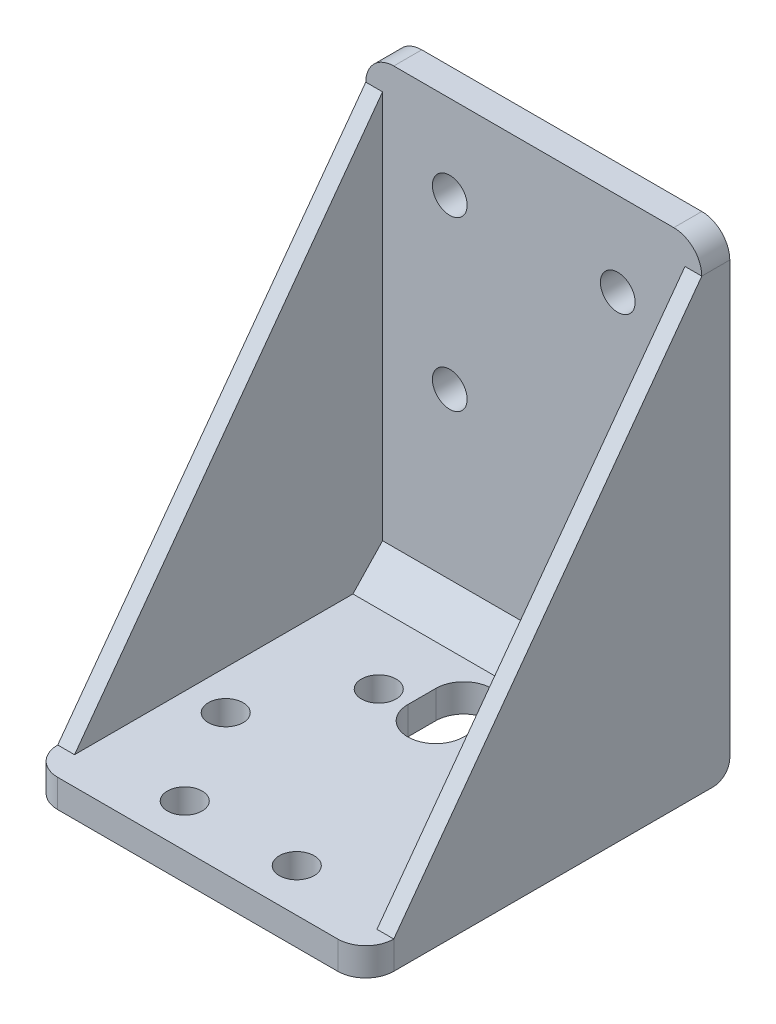
ISO-10303-21;
HEADER;
FILE_DESCRIPTION(('STEP AP214'),'2;1');
FILE_NAME('part.step','',(''),(''),'','','');
FILE_SCHEMA(('AUTOMOTIVE_DESIGN { 1 0 10303 214 1 1 1 1 }'));
ENDSEC;
DATA;
#1=APPLICATION_CONTEXT('core data for automotive mechanical design processes');
#2=APPLICATION_PROTOCOL_DEFINITION('international standard','automotive_design',2000,#1);
#3=PRODUCT_CONTEXT('',#1,'mechanical');
#4=PRODUCT('Part','Part','',(#3));
#5=PRODUCT_RELATED_PRODUCT_CATEGORY('part','',(#4));
#6=PRODUCT_DEFINITION_FORMATION('','',#4);
#7=PRODUCT_DEFINITION_CONTEXT('part definition',#1,'design');
#8=PRODUCT_DEFINITION('design','',#6,#7);
#9=PRODUCT_DEFINITION_SHAPE('','',#8);
#10=(LENGTH_UNIT() NAMED_UNIT(*) SI_UNIT(.MILLI.,.METRE.));
#11=(NAMED_UNIT(*) PLANE_ANGLE_UNIT() SI_UNIT($,.RADIAN.));
#12=(NAMED_UNIT(*) SI_UNIT($,.STERADIAN.) SOLID_ANGLE_UNIT());
#13=UNCERTAINTY_MEASURE_WITH_UNIT(LENGTH_MEASURE(1.E-05),#10,'distance_accuracy_value','');
#14=(GEOMETRIC_REPRESENTATION_CONTEXT(3) GLOBAL_UNCERTAINTY_ASSIGNED_CONTEXT((#13)) GLOBAL_UNIT_ASSIGNED_CONTEXT((#10,
#11,#12)) REPRESENTATION_CONTEXT('',''));
#15=CARTESIAN_POINT('',(0.,0.,0.));
#16=DIRECTION('',(0.,0.,1.));
#17=DIRECTION('',(1.,0.,0.));
#18=AXIS2_PLACEMENT_3D('',#15,#16,#17);
#19=CARTESIAN_POINT('',(57.,80.,0.));
#20=DIRECTION('',(0.,0.591363663627517,0.806404995855706));
#21=DIRECTION('',(0.,-0.806404995855706,0.591363663627517));
#22=AXIS2_PLACEMENT_3D('',#19,#20,#21);
#23=PLANE('',#22);
#24=DIRECTION('',(1.,0.,0.));
#25=VECTOR('',#24,1.);
#26=CARTESIAN_POINT('',(57.,80.,0.));
#27=LINE('',#26,#25);
#28=CARTESIAN_POINT('',(60.,80.,0.));
#29=VERTEX_POINT('',#28);
#30=CARTESIAN_POINT('',(57.,80.,0.));
#31=VERTEX_POINT('',#30);
#32=EDGE_CURVE('E250',#29,#31,#27,.F.);
#33=ORIENTED_EDGE('',*,*,#32,.T.);
#34=DIRECTION('',(0.,0.806404995855705,-0.591363663627517));
#35=VECTOR('',#34,1.);
#36=CARTESIAN_POINT('',(57.,5.,55.));
#37=LINE('',#36,#35);
#38=CARTESIAN_POINT('',(57.,5.,55.));
#39=VERTEX_POINT('',#38);
#40=EDGE_CURVE('E239',#39,#31,#37,.T.);
#41=ORIENTED_EDGE('',*,*,#40,.F.);
#42=DIRECTION('',(1.,0.,0.));
#43=VECTOR('',#42,1.);
#44=CARTESIAN_POINT('',(57.,5.,55.));
#45=LINE('',#44,#43);
#46=CARTESIAN_POINT('',(60.,5.,55.));
#47=VERTEX_POINT('',#46);
#48=EDGE_CURVE('E261',#39,#47,#45,.T.);
#49=ORIENTED_EDGE('',*,*,#48,.T.);
#50=DIRECTION('',(0.,0.806404995855706,-0.591363663627517));
#51=VECTOR('',#50,1.);
#52=CARTESIAN_POINT('',(60.,5.,55.));
#53=LINE('',#52,#51);
#54=EDGE_CURVE('E256',#47,#29,#53,.T.);
#55=ORIENTED_EDGE('',*,*,#54,.T.);
#56=EDGE_LOOP('',(#33,#41,#49,#55));
#57=FACE_BOUND('',#56,.T.);
#58=ADVANCED_FACE('F52',(#57),#23,.T.);
#59=CARTESIAN_POINT('',(60.,5.,0.));
#60=DIRECTION('',(-1.,0.,0.));
#61=DIRECTION('',(0.,0.,1.));
#62=AXIS2_PLACEMENT_3D('',#59,#60,#61);
#63=PLANE('',#62);
#64=DIRECTION('',(0.,-1.,0.));
#65=VECTOR('',#64,1.);
#66=CARTESIAN_POINT('',(60.,0.,-5.));
#67=LINE('',#66,#65);
#68=CARTESIAN_POINT('',(60.,80.,-5.));
#69=VERTEX_POINT('',#68);
#70=CARTESIAN_POINT('',(60.,3.,-5.));
#71=VERTEX_POINT('',#70);
#72=EDGE_CURVE('E225',#69,#71,#67,.T.);
#73=ORIENTED_EDGE('',*,*,#72,.F.);
#74=DIRECTION('',(0.,0.,1.));
#75=VECTOR('',#74,1.);
#76=CARTESIAN_POINT('',(60.,80.,0.));
#77=LINE('',#76,#75);
#78=EDGE_CURVE('E309',#69,#29,#77,.T.);
#79=ORIENTED_EDGE('',*,*,#78,.T.);
#80=ORIENTED_EDGE('',*,*,#54,.F.);
#81=DIRECTION('',(0.,1.,0.));
#82=VECTOR('',#81,1.);
#83=CARTESIAN_POINT('',(60.,5.,55.));
#84=LINE('',#83,#82);
#85=CARTESIAN_POINT('',(60.,0.,55.));
#86=VERTEX_POINT('',#85);
#87=EDGE_CURVE('E307',#47,#86,#84,.F.);
#88=ORIENTED_EDGE('',*,*,#87,.T.);
#89=DIRECTION('',(0.,0.,1.));
#90=VECTOR('',#89,1.);
#91=CARTESIAN_POINT('',(60.,0.,60.));
#92=LINE('',#91,#90);
#93=CARTESIAN_POINT('',(60.,0.,-2.));
#94=VERTEX_POINT('',#93);
#95=EDGE_CURVE('E230',#94,#86,#92,.T.);
#96=ORIENTED_EDGE('',*,*,#95,.F.);
#97=CARTESIAN_POINT('',(60.,3.,-2.));
#98=DIRECTION('',(-1.,0.,0.));
#99=DIRECTION('',(0.,0.,1.));
#100=AXIS2_PLACEMENT_3D('',#97,#98,#99);
#101=CIRCLE('',#100,3.);
#102=EDGE_CURVE('E304',#94,#71,#101,.F.);
#103=ORIENTED_EDGE('',*,*,#102,.T.);
#104=EDGE_LOOP('',(#73,#79,#80,#88,#96,#103));
#105=FACE_BOUND('',#104,.T.);
#106=ADVANCED_FACE('F376',(#105),#63,.F.);
#107=CARTESIAN_POINT('',(0.,5.,0.));
#108=DIRECTION('',(1.,0.,0.));
#109=DIRECTION('',(0.,0.,-1.));
#110=AXIS2_PLACEMENT_3D('',#107,#108,#109);
#111=PLANE('',#110);
#112=DIRECTION('',(0.,-0.806404995855706,0.591363663627517));
#113=VECTOR('',#112,1.);
#114=CARTESIAN_POINT('',(0.,80.,0.));
#115=LINE('',#114,#113);
#116=CARTESIAN_POINT('',(0.,80.,0.));
#117=VERTEX_POINT('',#116);
#118=CARTESIAN_POINT('',(0.,5.,55.));
#119=VERTEX_POINT('',#118);
#120=EDGE_CURVE('E244',#117,#119,#115,.T.);
#121=ORIENTED_EDGE('',*,*,#120,.F.);
#122=DIRECTION('',(0.,0.,1.));
#123=VECTOR('',#122,1.);
#124=CARTESIAN_POINT('',(0.,80.,0.));
#125=LINE('',#124,#123);
#126=CARTESIAN_POINT('',(0.,80.,-5.));
#127=VERTEX_POINT('',#126);
#128=EDGE_CURVE('E328',#117,#127,#125,.F.);
#129=ORIENTED_EDGE('',*,*,#128,.T.);
#130=DIRECTION('',(0.,1.,0.));
#131=VECTOR('',#130,1.);
#132=CARTESIAN_POINT('',(0.,85.,-5.));
#133=LINE('',#132,#131);
#134=CARTESIAN_POINT('',(0.,3.,-5.));
#135=VERTEX_POINT('',#134);
#136=EDGE_CURVE('E219',#135,#127,#133,.T.);
#137=ORIENTED_EDGE('',*,*,#136,.F.);
#138=CARTESIAN_POINT('',(0.,3.,-2.));
#139=DIRECTION('',(1.,0.,0.));
#140=DIRECTION('',(0.,0.,-1.));
#141=AXIS2_PLACEMENT_3D('',#138,#139,#140);
#142=CIRCLE('',#141,3.);
#143=CARTESIAN_POINT('',(0.,0.,-2.));
#144=VERTEX_POINT('',#143);
#145=EDGE_CURVE('E299',#135,#144,#142,.F.);
#146=ORIENTED_EDGE('',*,*,#145,.T.);
#147=DIRECTION('',(0.,0.,-1.));
#148=VECTOR('',#147,1.);
#149=CARTESIAN_POINT('',(0.,0.,0.));
#150=LINE('',#149,#148);
#151=CARTESIAN_POINT('',(0.,0.,55.));
#152=VERTEX_POINT('',#151);
#153=EDGE_CURVE('E235',#152,#144,#150,.T.);
#154=ORIENTED_EDGE('',*,*,#153,.F.);
#155=DIRECTION('',(0.,1.,0.));
#156=VECTOR('',#155,1.);
#157=CARTESIAN_POINT('',(0.,5.,55.));
#158=LINE('',#157,#156);
#159=EDGE_CURVE('E325',#152,#119,#158,.T.);
#160=ORIENTED_EDGE('',*,*,#159,.T.);
#161=EDGE_LOOP('',(#121,#129,#137,#146,#154,#160));
#162=FACE_BOUND('',#161,.T.);
#163=ADVANCED_FACE('F352',(#162),#111,.F.);
#164=DIRECTION('',(0.,0.806404995855705,-0.591363663627517));
#165=VECTOR('',#164,1.);
#166=CARTESIAN_POINT('',(3.,5.,55.));
#167=LINE('',#166,#165);
#168=CARTESIAN_POINT('',(3.,5.,55.));
#169=VERTEX_POINT('',#168);
#170=CARTESIAN_POINT('',(3.,80.,0.));
#171=VERTEX_POINT('',#170);
#172=EDGE_CURVE('E272',#169,#171,#167,.T.);
#173=ORIENTED_EDGE('',*,*,#172,.T.);
#174=DIRECTION('',(-1.,0.,0.));
#175=VECTOR('',#174,1.);
#176=CARTESIAN_POINT('',(0.,80.,0.));
#177=LINE('',#176,#175);
#178=EDGE_CURVE('E240',#171,#117,#177,.T.);
#179=ORIENTED_EDGE('',*,*,#178,.T.);
#180=ORIENTED_EDGE('',*,*,#120,.T.);
#181=DIRECTION('',(1.,0.,0.));
#182=VECTOR('',#181,1.);
#183=CARTESIAN_POINT('',(3.,5.,55.));
#184=LINE('',#183,#182);
#185=EDGE_CURVE('E237',#169,#119,#184,.F.);
#186=ORIENTED_EDGE('',*,*,#185,.F.);
#187=EDGE_LOOP('',(#173,#179,#180,#186));
#188=FACE_BOUND('',#187,.T.);
#189=ADVANCED_FACE('F354',(#188),#23,.T.);
#190=CARTESIAN_POINT('',(0.,5.,0.));
#191=DIRECTION('',(0.,1.,0.));
#192=DIRECTION('',(0.,0.,1.));
#193=AXIS2_PLACEMENT_3D('',#190,#191,#192);
#194=PLANE('',#193);
#195=CARTESIAN_POINT('',(40.,5.,17.6794919243114));
#196=DIRECTION('',(0.,1.,0.));
#197=DIRECTION('',(0.,0.,1.));
#198=AXIS2_PLACEMENT_3D('',#195,#196,#197);
#199=CIRCLE('',#198,3.09999999999998);
#200=CARTESIAN_POINT('',(40.,5.,20.7794919243113));
#201=VERTEX_POINT('',#200);
#202=EDGE_CURVE('E820',#201,#201,#199,.T.);
#203=ORIENTED_EDGE('',*,*,#202,.F.);
#204=EDGE_LOOP('',(#203));
#205=FACE_BOUND('',#204,.T.);
#206=CARTESIAN_POINT('',(20.,5.,17.6794919243111));
#207=DIRECTION('',(0.,1.,0.));
#208=DIRECTION('',(0.,0.,1.));
#209=AXIS2_PLACEMENT_3D('',#206,#207,#208);
#210=CIRCLE('',#209,3.09999999999999);
#211=CARTESIAN_POINT('',(20.,5.,20.7794919243111));
#212=VERTEX_POINT('',#211);
#213=EDGE_CURVE('E816',#212,#212,#210,.T.);
#214=ORIENTED_EDGE('',*,*,#213,.F.);
#215=EDGE_LOOP('',(#214));
#216=FACE_BOUND('',#215,.T.);
#217=CARTESIAN_POINT('',(50.,5.,35.));
#218=DIRECTION('',(0.,1.,0.));
#219=DIRECTION('',(0.,0.,1.));
#220=AXIS2_PLACEMENT_3D('',#217,#218,#219);
#221=CIRCLE('',#220,3.09999999999999);
#222=CARTESIAN_POINT('',(50.,5.,38.1));
#223=VERTEX_POINT('',#222);
#224=EDGE_CURVE('E812',#223,#223,#221,.T.);
#225=ORIENTED_EDGE('',*,*,#224,.F.);
#226=EDGE_LOOP('',(#225));
#227=FACE_BOUND('',#226,.T.);
#228=CARTESIAN_POINT('',(40.,5.,52.3205080756888));
#229=DIRECTION('',(0.,1.,0.));
#230=DIRECTION('',(0.,0.,1.));
#231=AXIS2_PLACEMENT_3D('',#228,#229,#230);
#232=CIRCLE('',#231,3.09999999999998);
#233=CARTESIAN_POINT('',(40.,5.,55.4205080756888));
#234=VERTEX_POINT('',#233);
#235=EDGE_CURVE('E808',#234,#234,#232,.T.);
#236=ORIENTED_EDGE('',*,*,#235,.F.);
#237=EDGE_LOOP('',(#236));
#238=FACE_BOUND('',#237,.T.);
#239=CARTESIAN_POINT('',(20.,5.,52.3205080756887));
#240=DIRECTION('',(0.,1.,0.));
#241=DIRECTION('',(0.,0.,1.));
#242=AXIS2_PLACEMENT_3D('',#239,#240,#241);
#243=CIRCLE('',#242,3.09999999999999);
#244=CARTESIAN_POINT('',(20.,5.,55.4205080756887));
#245=VERTEX_POINT('',#244);
#246=EDGE_CURVE('E804',#245,#245,#243,.T.);
#247=ORIENTED_EDGE('',*,*,#246,.F.);
#248=EDGE_LOOP('',(#247));
#249=FACE_BOUND('',#248,.T.);
#250=CARTESIAN_POINT('',(10.,5.,35.));
#251=DIRECTION('',(0.,1.,0.));
#252=DIRECTION('',(0.,0.,1.));
#253=AXIS2_PLACEMENT_3D('',#250,#251,#252);
#254=CIRCLE('',#253,3.09999999999999);
#255=CARTESIAN_POINT('',(10.,5.,38.1));
#256=VERTEX_POINT('',#255);
#257=EDGE_CURVE('E733',#256,#256,#254,.T.);
#258=ORIENTED_EDGE('',*,*,#257,.F.);
#259=EDGE_LOOP('',(#258));
#260=FACE_BOUND('',#259,.T.);
#261=CARTESIAN_POINT('',(30.,5.,12.5));
#262=DIRECTION('',(0.,1.,0.));
#263=DIRECTION('',(0.,0.,1.));
#264=AXIS2_PLACEMENT_3D('',#261,#262,#263);
#265=CIRCLE('',#264,5.);
#266=CARTESIAN_POINT('',(35.,5.,12.5));
#267=VERTEX_POINT('',#266);
#268=CARTESIAN_POINT('',(25.,5.,12.5));
#269=VERTEX_POINT('',#268);
#270=EDGE_CURVE('E216',#267,#269,#265,.T.);
#271=ORIENTED_EDGE('',*,*,#270,.F.);
#272=DIRECTION('',(0.,0.,-1.));
#273=VECTOR('',#272,1.);
#274=CARTESIAN_POINT('',(35.,5.,0.));
#275=LINE('',#274,#273);
#276=CARTESIAN_POINT('',(35.,5.,17.5));
#277=VERTEX_POINT('',#276);
#278=EDGE_CURVE('E209',#277,#267,#275,.T.);
#279=ORIENTED_EDGE('',*,*,#278,.F.);
#280=CARTESIAN_POINT('',(30.,5.,17.5));
#281=DIRECTION('',(0.,1.,0.));
#282=DIRECTION('',(0.,0.,1.));
#283=AXIS2_PLACEMENT_3D('',#280,#281,#282);
#284=CIRCLE('',#283,5.);
#285=CARTESIAN_POINT('',(25.,5.,17.5));
#286=VERTEX_POINT('',#285);
#287=EDGE_CURVE('E185',#286,#277,#284,.T.);
#288=ORIENTED_EDGE('',*,*,#287,.F.);
#289=DIRECTION('',(0.,0.,1.));
#290=VECTOR('',#289,1.);
#291=CARTESIAN_POINT('',(25.,5.,0.));
#292=LINE('',#291,#290);
#293=EDGE_CURVE('E214',#269,#286,#292,.T.);
#294=ORIENTED_EDGE('',*,*,#293,.F.);
#295=EDGE_LOOP('',(#271,#279,#288,#294));
#296=FACE_BOUND('',#295,.T.);
#297=ORIENTED_EDGE('',*,*,#185,.T.);
#298=CARTESIAN_POINT('',(5.,5.,55.));
#299=DIRECTION('',(0.,1.,0.));
#300=DIRECTION('',(0.,0.,1.));
#301=AXIS2_PLACEMENT_3D('',#298,#299,#300);
#302=CIRCLE('',#301,5.);
#303=CARTESIAN_POINT('',(5.,5.,60.));
#304=VERTEX_POINT('',#303);
#305=EDGE_CURVE('E332',#119,#304,#302,.T.);
#306=ORIENTED_EDGE('',*,*,#305,.T.);
#307=DIRECTION('',(-1.,0.,0.));
#308=VECTOR('',#307,1.);
#309=CARTESIAN_POINT('',(0.,5.,60.));
#310=LINE('',#309,#308);
#311=CARTESIAN_POINT('',(55.,5.,60.));
#312=VERTEX_POINT('',#311);
#313=EDGE_CURVE('E233',#312,#304,#310,.T.);
#314=ORIENTED_EDGE('',*,*,#313,.F.);
#315=CARTESIAN_POINT('',(55.,5.,55.));
#316=DIRECTION('',(0.,1.,0.));
#317=DIRECTION('',(0.,0.,1.));
#318=AXIS2_PLACEMENT_3D('',#315,#316,#317);
#319=CIRCLE('',#318,5.);
#320=EDGE_CURVE('E330',#312,#47,#319,.T.);
#321=ORIENTED_EDGE('',*,*,#320,.T.);
#322=ORIENTED_EDGE('',*,*,#48,.F.);
#323=DIRECTION('',(0.,0.,1.));
#324=VECTOR('',#323,1.);
#325=CARTESIAN_POINT('',(57.,5.,0.));
#326=LINE('',#325,#324);
#327=CARTESIAN_POINT('',(57.,5.,5.29154741695946));
#328=VERTEX_POINT('',#327);
#329=EDGE_CURVE('E286',#328,#39,#326,.T.);
#330=ORIENTED_EDGE('',*,*,#329,.F.);
#331=DIRECTION('',(-1.,0.,0.));
#332=VECTOR('',#331,1.);
#333=CARTESIAN_POINT('',(3.,5.,5.29154741695946));
#334=LINE('',#333,#332);
#335=CARTESIAN_POINT('',(3.,5.,5.29154741695946));
#336=VERTEX_POINT('',#335);
#337=EDGE_CURVE('E260',#328,#336,#334,.T.);
#338=ORIENTED_EDGE('',*,*,#337,.T.);
#339=DIRECTION('',(0.,0.,1.));
#340=VECTOR('',#339,1.);
#341=CARTESIAN_POINT('',(3.,5.,0.));
#342=LINE('',#341,#340);
#343=EDGE_CURVE('E276',#336,#169,#342,.T.);
#344=ORIENTED_EDGE('',*,*,#343,.T.);
#345=EDGE_LOOP('',(#297,#306,#314,#321,#322,#330,#338,#344));
#346=FACE_BOUND('',#345,.T.);
#347=ADVANCED_FACE('F342',(#205,#216,#227,#238,#249,#260,#296,#346),#194,.T.);
#348=CARTESIAN_POINT('',(0.,0.,60.));
#349=DIRECTION('',(0.,0.,-1.));
#350=DIRECTION('',(-1.,0.,0.));
#351=AXIS2_PLACEMENT_3D('',#348,#349,#350);
#352=PLANE('',#351);
#353=ORIENTED_EDGE('',*,*,#313,.T.);
#354=DIRECTION('',(0.,1.,0.));
#355=VECTOR('',#354,1.);
#356=CARTESIAN_POINT('',(5.,0.,60.));
#357=LINE('',#356,#355);
#358=CARTESIAN_POINT('',(5.,0.,60.));
#359=VERTEX_POINT('',#358);
#360=EDGE_CURVE('E67',#304,#359,#357,.F.);
#361=ORIENTED_EDGE('',*,*,#360,.T.);
#362=DIRECTION('',(-1.,0.,0.));
#363=VECTOR('',#362,1.);
#364=CARTESIAN_POINT('',(0.,0.,60.));
#365=LINE('',#364,#363);
#366=CARTESIAN_POINT('',(55.,0.,60.));
#367=VERTEX_POINT('',#366);
#368=EDGE_CURVE('E232',#367,#359,#365,.T.);
#369=ORIENTED_EDGE('',*,*,#368,.F.);
#370=DIRECTION('',(0.,1.,0.));
#371=VECTOR('',#370,1.);
#372=CARTESIAN_POINT('',(55.,0.,60.));
#373=LINE('',#372,#371);
#374=EDGE_CURVE('E334',#367,#312,#373,.T.);
#375=ORIENTED_EDGE('',*,*,#374,.T.);
#376=EDGE_LOOP('',(#353,#361,#369,#375));
#377=FACE_BOUND('',#376,.T.);
#378=ADVANCED_FACE('F339',(#377),#352,.F.);
#379=CARTESIAN_POINT('',(0.,0.,0.));
#380=DIRECTION('',(0.,1.,0.));
#381=DIRECTION('',(0.,0.,1.));
#382=AXIS2_PLACEMENT_3D('',#379,#380,#381);
#383=PLANE('',#382);
#384=CARTESIAN_POINT('',(40.,0.,17.6794919243114));
#385=DIRECTION('',(0.,1.,0.));
#386=DIRECTION('',(0.,0.,1.));
#387=AXIS2_PLACEMENT_3D('',#384,#385,#386);
#388=CIRCLE('',#387,3.09999999999998);
#389=CARTESIAN_POINT('',(40.,0.,20.7794919243113));
#390=VERTEX_POINT('',#389);
#391=EDGE_CURVE('E712',#390,#390,#388,.T.);
#392=ORIENTED_EDGE('',*,*,#391,.T.);
#393=EDGE_LOOP('',(#392));
#394=FACE_BOUND('',#393,.T.);
#395=CARTESIAN_POINT('',(20.,0.,17.6794919243111));
#396=DIRECTION('',(0.,1.,0.));
#397=DIRECTION('',(0.,0.,1.));
#398=AXIS2_PLACEMENT_3D('',#395,#396,#397);
#399=CIRCLE('',#398,3.09999999999999);
#400=CARTESIAN_POINT('',(20.,0.,20.7794919243111));
#401=VERTEX_POINT('',#400);
#402=EDGE_CURVE('E716',#401,#401,#399,.T.);
#403=ORIENTED_EDGE('',*,*,#402,.T.);
#404=EDGE_LOOP('',(#403));
#405=FACE_BOUND('',#404,.T.);
#406=CARTESIAN_POINT('',(50.,0.,35.));
#407=DIRECTION('',(0.,1.,0.));
#408=DIRECTION('',(0.,0.,1.));
#409=AXIS2_PLACEMENT_3D('',#406,#407,#408);
#410=CIRCLE('',#409,3.09999999999998);
#411=CARTESIAN_POINT('',(50.,0.,38.1));
#412=VERTEX_POINT('',#411);
#413=EDGE_CURVE('E720',#412,#412,#410,.T.);
#414=ORIENTED_EDGE('',*,*,#413,.T.);
#415=EDGE_LOOP('',(#414));
#416=FACE_BOUND('',#415,.T.);
#417=CARTESIAN_POINT('',(40.,0.,52.3205080756888));
#418=DIRECTION('',(0.,1.,0.));
#419=DIRECTION('',(0.,0.,1.));
#420=AXIS2_PLACEMENT_3D('',#417,#418,#419);
#421=CIRCLE('',#420,3.09999999999998);
#422=CARTESIAN_POINT('',(40.,0.,55.4205080756888));
#423=VERTEX_POINT('',#422);
#424=EDGE_CURVE('E724',#423,#423,#421,.T.);
#425=ORIENTED_EDGE('',*,*,#424,.T.);
#426=EDGE_LOOP('',(#425));
#427=FACE_BOUND('',#426,.T.);
#428=CARTESIAN_POINT('',(20.,0.,52.3205080756887));
#429=DIRECTION('',(0.,1.,0.));
#430=DIRECTION('',(0.,0.,1.));
#431=AXIS2_PLACEMENT_3D('',#428,#429,#430);
#432=CIRCLE('',#431,3.09999999999999);
#433=CARTESIAN_POINT('',(20.,0.,55.4205080756887));
#434=VERTEX_POINT('',#433);
#435=EDGE_CURVE('E728',#434,#434,#432,.T.);
#436=ORIENTED_EDGE('',*,*,#435,.T.);
#437=EDGE_LOOP('',(#436));
#438=FACE_BOUND('',#437,.T.);
#439=CARTESIAN_POINT('',(10.,0.,35.));
#440=DIRECTION('',(0.,1.,0.));
#441=DIRECTION('',(0.,0.,1.));
#442=AXIS2_PLACEMENT_3D('',#439,#440,#441);
#443=CIRCLE('',#442,3.09999999999999);
#444=CARTESIAN_POINT('',(10.,0.,38.1));
#445=VERTEX_POINT('',#444);
#446=EDGE_CURVE('E731',#445,#445,#443,.T.);
#447=ORIENTED_EDGE('',*,*,#446,.T.);
#448=EDGE_LOOP('',(#447));
#449=FACE_BOUND('',#448,.T.);
#450=DIRECTION('',(0.,0.,1.));
#451=VECTOR('',#450,1.);
#452=CARTESIAN_POINT('',(35.,0.,12.5));
#453=LINE('',#452,#451);
#454=CARTESIAN_POINT('',(35.,0.,12.5));
#455=VERTEX_POINT('',#454);
#456=CARTESIAN_POINT('',(35.,0.,17.5));
#457=VERTEX_POINT('',#456);
#458=EDGE_CURVE('E193',#455,#457,#453,.T.);
#459=ORIENTED_EDGE('',*,*,#458,.F.);
#460=CARTESIAN_POINT('',(30.,0.,12.5));
#461=DIRECTION('',(0.,-1.,0.));
#462=DIRECTION('',(0.,0.,-1.));
#463=AXIS2_PLACEMENT_3D('',#460,#461,#462);
#464=CIRCLE('',#463,5.);
#465=CARTESIAN_POINT('',(25.,0.,12.5));
#466=VERTEX_POINT('',#465);
#467=EDGE_CURVE('E198',#466,#455,#464,.T.);
#468=ORIENTED_EDGE('',*,*,#467,.F.);
#469=DIRECTION('',(0.,0.,-1.));
#470=VECTOR('',#469,1.);
#471=CARTESIAN_POINT('',(25.,0.,17.5));
#472=LINE('',#471,#470);
#473=CARTESIAN_POINT('',(25.,0.,17.5));
#474=VERTEX_POINT('',#473);
#475=EDGE_CURVE('E202',#474,#466,#472,.T.);
#476=ORIENTED_EDGE('',*,*,#475,.F.);
#477=CARTESIAN_POINT('',(30.,0.,17.5));
#478=DIRECTION('',(0.,-1.,0.));
#479=DIRECTION('',(0.,0.,-1.));
#480=AXIS2_PLACEMENT_3D('',#477,#478,#479);
#481=CIRCLE('',#480,5.);
#482=EDGE_CURVE('E182',#457,#474,#481,.T.);
#483=ORIENTED_EDGE('',*,*,#482,.F.);
#484=EDGE_LOOP('',(#459,#468,#476,#483));
#485=FACE_BOUND('',#484,.T.);
#486=ORIENTED_EDGE('',*,*,#368,.T.);
#487=CARTESIAN_POINT('',(5.,0.,55.));
#488=DIRECTION('',(0.,1.,0.));
#489=DIRECTION('',(0.,0.,1.));
#490=AXIS2_PLACEMENT_3D('',#487,#488,#489);
#491=CIRCLE('',#490,5.);
#492=EDGE_CURVE('E12',#359,#152,#491,.F.);
#493=ORIENTED_EDGE('',*,*,#492,.T.);
#494=ORIENTED_EDGE('',*,*,#153,.T.);
#495=DIRECTION('',(-1.,0.,0.));
#496=VECTOR('',#495,1.);
#497=CARTESIAN_POINT('',(0.,0.,-2.));
#498=LINE('',#497,#496);
#499=EDGE_CURVE('E302',#144,#94,#498,.F.);
#500=ORIENTED_EDGE('',*,*,#499,.T.);
#501=ORIENTED_EDGE('',*,*,#95,.T.);
#502=CARTESIAN_POINT('',(55.,0.,55.));
#503=DIRECTION('',(0.,1.,0.));
#504=DIRECTION('',(0.,0.,1.));
#505=AXIS2_PLACEMENT_3D('',#502,#503,#504);
#506=CIRCLE('',#505,5.);
#507=EDGE_CURVE('E60',#86,#367,#506,.F.);
#508=ORIENTED_EDGE('',*,*,#507,.T.);
#509=EDGE_LOOP('',(#486,#493,#494,#500,#501,#508));
#510=FACE_BOUND('',#509,.T.);
#511=ADVANCED_FACE('F200',(#394,#405,#416,#427,#438,#449,#485,#510),#383,.F.);
#512=CARTESIAN_POINT('',(57.,0.,0.));
#513=DIRECTION('',(-1.,0.,0.));
#514=DIRECTION('',(0.,0.,1.));
#515=AXIS2_PLACEMENT_3D('',#512,#513,#514);
#516=PLANE('',#515);
#517=DIRECTION('',(0.,-1.,0.));
#518=VECTOR('',#517,1.);
#519=CARTESIAN_POINT('',(57.,80.,0.));
#520=LINE('',#519,#518);
#521=CARTESIAN_POINT('',(57.,10.5896242378663,0.));
#522=VERTEX_POINT('',#521);
#523=EDGE_CURVE('E275',#31,#522,#520,.T.);
#524=ORIENTED_EDGE('',*,*,#523,.T.);
#525=DIRECTION('',(0.,0.726204706080068,-0.687478526840774));
#526=VECTOR('',#525,1.);
#527=CARTESIAN_POINT('',(57.,5.00493942111665,5.28687139940644));
#528=LINE('',#527,#526);
#529=EDGE_CURVE('E294',#522,#328,#528,.F.);
#530=ORIENTED_EDGE('',*,*,#529,.T.);
#531=ORIENTED_EDGE('',*,*,#329,.T.);
#532=ORIENTED_EDGE('',*,*,#40,.T.);
#533=EDGE_LOOP('',(#524,#530,#531,#532));
#534=FACE_BOUND('',#533,.T.);
#535=ADVANCED_FACE('F603',(#534),#516,.T.);
#536=CARTESIAN_POINT('',(3.,0.,0.));
#537=DIRECTION('',(-1.,0.,0.));
#538=DIRECTION('',(0.,0.,1.));
#539=AXIS2_PLACEMENT_3D('',#536,#537,#538);
#540=PLANE('',#539);
#541=ORIENTED_EDGE('',*,*,#343,.F.);
#542=DIRECTION('',(0.,-0.726204706080068,0.687478526840774));
#543=VECTOR('',#542,1.);
#544=CARTESIAN_POINT('',(3.,5.,5.29154741695946));
#545=LINE('',#544,#543);
#546=CARTESIAN_POINT('',(3.,10.5896242378663,0.));
#547=VERTEX_POINT('',#546);
#548=EDGE_CURVE('E290',#336,#547,#545,.F.);
#549=ORIENTED_EDGE('',*,*,#548,.T.);
#550=DIRECTION('',(0.,-1.,0.));
#551=VECTOR('',#550,1.);
#552=CARTESIAN_POINT('',(3.,80.,0.));
#553=LINE('',#552,#551);
#554=EDGE_CURVE('E227',#171,#547,#553,.T.);
#555=ORIENTED_EDGE('',*,*,#554,.F.);
#556=ORIENTED_EDGE('',*,*,#172,.F.);
#557=EDGE_LOOP('',(#541,#549,#555,#556));
#558=FACE_BOUND('',#557,.T.);
#559=ADVANCED_FACE('F593',(#558),#540,.F.);
#560=CARTESIAN_POINT('',(0.,0.,0.));
#561=DIRECTION('',(0.,0.,1.));
#562=DIRECTION('',(1.,0.,0.));
#563=AXIS2_PLACEMENT_3D('',#560,#561,#562);
#564=PLANE('',#563);
#565=CARTESIAN_POINT('',(15.,70.,0.));
#566=DIRECTION('',(0.,0.,1.));
#567=DIRECTION('',(1.,0.,0.));
#568=AXIS2_PLACEMENT_3D('',#565,#566,#567);
#569=CIRCLE('',#568,3.09999999999998);
#570=CARTESIAN_POINT('',(18.1,70.,0.));
#571=VERTEX_POINT('',#570);
#572=EDGE_CURVE('E732',#571,#571,#569,.T.);
#573=ORIENTED_EDGE('',*,*,#572,.F.);
#574=EDGE_LOOP('',(#573));
#575=FACE_BOUND('',#574,.T.);
#576=CARTESIAN_POINT('',(45.,40.,0.));
#577=DIRECTION('',(0.,0.,1.));
#578=DIRECTION('',(1.,0.,0.));
#579=AXIS2_PLACEMENT_3D('',#576,#577,#578);
#580=CIRCLE('',#579,3.09999999999998);
#581=CARTESIAN_POINT('',(48.1,40.,0.));
#582=VERTEX_POINT('',#581);
#583=EDGE_CURVE('E744',#582,#582,#580,.T.);
#584=ORIENTED_EDGE('',*,*,#583,.F.);
#585=EDGE_LOOP('',(#584));
#586=FACE_BOUND('',#585,.T.);
#587=CARTESIAN_POINT('',(15.,40.,0.));
#588=DIRECTION('',(0.,0.,1.));
#589=DIRECTION('',(1.,0.,0.));
#590=AXIS2_PLACEMENT_3D('',#587,#588,#589);
#591=CIRCLE('',#590,3.09999999999998);
#592=CARTESIAN_POINT('',(18.1,40.,0.));
#593=VERTEX_POINT('',#592);
#594=EDGE_CURVE('E750',#593,#593,#591,.T.);
#595=ORIENTED_EDGE('',*,*,#594,.F.);
#596=EDGE_LOOP('',(#595));
#597=FACE_BOUND('',#596,.T.);
#598=CARTESIAN_POINT('',(45.,70.,0.));
#599=DIRECTION('',(0.,0.,1.));
#600=DIRECTION('',(1.,0.,0.));
#601=AXIS2_PLACEMENT_3D('',#598,#599,#600);
#602=CIRCLE('',#601,3.09999999999998);
#603=CARTESIAN_POINT('',(48.1,70.,0.));
#604=VERTEX_POINT('',#603);
#605=EDGE_CURVE('E756',#604,#604,#602,.T.);
#606=ORIENTED_EDGE('',*,*,#605,.F.);
#607=EDGE_LOOP('',(#606));
#608=FACE_BOUND('',#607,.T.);
#609=ORIENTED_EDGE('',*,*,#32,.F.);
#610=CARTESIAN_POINT('',(55.,80.,0.));
#611=DIRECTION('',(0.,0.,1.));
#612=DIRECTION('',(1.,0.,0.));
#613=AXIS2_PLACEMENT_3D('',#610,#611,#612);
#614=CIRCLE('',#613,5.);
#615=CARTESIAN_POINT('',(55.,85.,0.));
#616=VERTEX_POINT('',#615);
#617=EDGE_CURVE('E314',#29,#616,#614,.T.);
#618=ORIENTED_EDGE('',*,*,#617,.T.);
#619=DIRECTION('',(1.,0.,0.));
#620=VECTOR('',#619,1.);
#621=CARTESIAN_POINT('',(60.,85.,0.));
#622=LINE('',#621,#620);
#623=CARTESIAN_POINT('',(5.,85.,0.));
#624=VERTEX_POINT('',#623);
#625=EDGE_CURVE('E218',#624,#616,#622,.T.);
#626=ORIENTED_EDGE('',*,*,#625,.F.);
#627=CARTESIAN_POINT('',(5.,80.,0.));
#628=DIRECTION('',(0.,0.,1.));
#629=DIRECTION('',(1.,0.,0.));
#630=AXIS2_PLACEMENT_3D('',#627,#628,#629);
#631=CIRCLE('',#630,5.);
#632=EDGE_CURVE('E312',#624,#117,#631,.T.);
#633=ORIENTED_EDGE('',*,*,#632,.T.);
#634=ORIENTED_EDGE('',*,*,#178,.F.);
#635=ORIENTED_EDGE('',*,*,#554,.T.);
#636=DIRECTION('',(1.,0.,0.));
#637=VECTOR('',#636,1.);
#638=CARTESIAN_POINT('',(57.,10.5896242378663,0.));
#639=LINE('',#638,#637);
#640=EDGE_CURVE('E292',#547,#522,#639,.T.);
#641=ORIENTED_EDGE('',*,*,#640,.T.);
#642=ORIENTED_EDGE('',*,*,#523,.F.);
#643=EDGE_LOOP('',(#609,#618,#626,#633,#634,#635,#641,#642));
#644=FACE_BOUND('',#643,.T.);
#645=ADVANCED_FACE('F584',(#575,#586,#597,#608,#644),#564,.T.);
#646=CARTESIAN_POINT('',(60.,85.,-5.));
#647=DIRECTION('',(0.,-1.,0.));
#648=DIRECTION('',(0.,0.,-1.));
#649=AXIS2_PLACEMENT_3D('',#646,#647,#648);
#650=PLANE('',#649);
#651=ORIENTED_EDGE('',*,*,#625,.T.);
#652=DIRECTION('',(0.,0.,1.));
#653=VECTOR('',#652,1.);
#654=CARTESIAN_POINT('',(55.,85.,-5.));
#655=LINE('',#654,#653);
#656=CARTESIAN_POINT('',(55.,85.,-5.));
#657=VERTEX_POINT('',#656);
#658=EDGE_CURVE('E319',#616,#657,#655,.F.);
#659=ORIENTED_EDGE('',*,*,#658,.T.);
#660=DIRECTION('',(1.,0.,0.));
#661=VECTOR('',#660,1.);
#662=CARTESIAN_POINT('',(60.,85.,-5.));
#663=LINE('',#662,#661);
#664=CARTESIAN_POINT('',(5.,85.,-5.));
#665=VERTEX_POINT('',#664);
#666=EDGE_CURVE('E222',#665,#657,#663,.T.);
#667=ORIENTED_EDGE('',*,*,#666,.F.);
#668=DIRECTION('',(0.,0.,1.));
#669=VECTOR('',#668,1.);
#670=CARTESIAN_POINT('',(5.,85.,-4.99999999999999));
#671=LINE('',#670,#669);
#672=EDGE_CURVE('E316',#665,#624,#671,.T.);
#673=ORIENTED_EDGE('',*,*,#672,.T.);
#674=EDGE_LOOP('',(#651,#659,#667,#673));
#675=FACE_BOUND('',#674,.T.);
#676=ADVANCED_FACE('F575',(#675),#650,.F.);
#677=CARTESIAN_POINT('',(0.,0.,-5.));
#678=DIRECTION('',(0.,0.,1.));
#679=DIRECTION('',(1.,0.,0.));
#680=AXIS2_PLACEMENT_3D('',#677,#678,#679);
#681=PLANE('',#680);
#682=CARTESIAN_POINT('',(15.,70.,-5.));
#683=DIRECTION('',(0.,0.,1.));
#684=DIRECTION('',(1.,0.,0.));
#685=AXIS2_PLACEMENT_3D('',#682,#683,#684);
#686=CIRCLE('',#685,3.09999999999998);
#687=CARTESIAN_POINT('',(18.1,70.,-5.));
#688=VERTEX_POINT('',#687);
#689=EDGE_CURVE('E736',#688,#688,#686,.T.);
#690=ORIENTED_EDGE('',*,*,#689,.T.);
#691=EDGE_LOOP('',(#690));
#692=FACE_BOUND('',#691,.T.);
#693=CARTESIAN_POINT('',(45.,40.,-5.));
#694=DIRECTION('',(0.,0.,1.));
#695=DIRECTION('',(1.,0.,0.));
#696=AXIS2_PLACEMENT_3D('',#693,#694,#695);
#697=CIRCLE('',#696,3.09999999999998);
#698=CARTESIAN_POINT('',(48.1,40.,-5.));
#699=VERTEX_POINT('',#698);
#700=EDGE_CURVE('E747',#699,#699,#697,.T.);
#701=ORIENTED_EDGE('',*,*,#700,.T.);
#702=EDGE_LOOP('',(#701));
#703=FACE_BOUND('',#702,.T.);
#704=CARTESIAN_POINT('',(15.,40.,-5.));
#705=DIRECTION('',(0.,0.,1.));
#706=DIRECTION('',(1.,0.,0.));
#707=AXIS2_PLACEMENT_3D('',#704,#705,#706);
#708=CIRCLE('',#707,3.09999999999998);
#709=CARTESIAN_POINT('',(18.1,40.,-5.));
#710=VERTEX_POINT('',#709);
#711=EDGE_CURVE('E753',#710,#710,#708,.T.);
#712=ORIENTED_EDGE('',*,*,#711,.T.);
#713=EDGE_LOOP('',(#712));
#714=FACE_BOUND('',#713,.T.);
#715=CARTESIAN_POINT('',(45.,70.,-5.));
#716=DIRECTION('',(0.,0.,1.));
#717=DIRECTION('',(1.,0.,0.));
#718=AXIS2_PLACEMENT_3D('',#715,#716,#717);
#719=CIRCLE('',#718,3.09999999999998);
#720=CARTESIAN_POINT('',(48.1,70.,-5.));
#721=VERTEX_POINT('',#720);
#722=EDGE_CURVE('E759',#721,#721,#719,.T.);
#723=ORIENTED_EDGE('',*,*,#722,.T.);
#724=EDGE_LOOP('',(#723));
#725=FACE_BOUND('',#724,.T.);
#726=ORIENTED_EDGE('',*,*,#666,.T.);
#727=CARTESIAN_POINT('',(55.,80.,-5.));
#728=DIRECTION('',(0.,0.,1.));
#729=DIRECTION('',(1.,0.,0.));
#730=AXIS2_PLACEMENT_3D('',#727,#728,#729);
#731=CIRCLE('',#730,5.);
#732=EDGE_CURVE('E323',#657,#69,#731,.F.);
#733=ORIENTED_EDGE('',*,*,#732,.T.);
#734=ORIENTED_EDGE('',*,*,#72,.T.);
#735=DIRECTION('',(-1.,0.,0.));
#736=VECTOR('',#735,1.);
#737=CARTESIAN_POINT('',(0.,3.,-5.));
#738=LINE('',#737,#736);
#739=EDGE_CURVE('E296',#71,#135,#738,.T.);
#740=ORIENTED_EDGE('',*,*,#739,.T.);
#741=ORIENTED_EDGE('',*,*,#136,.T.);
#742=CARTESIAN_POINT('',(5.,80.,-5.));
#743=DIRECTION('',(0.,0.,1.));
#744=DIRECTION('',(1.,0.,0.));
#745=AXIS2_PLACEMENT_3D('',#742,#743,#744);
#746=CIRCLE('',#745,5.);
#747=EDGE_CURVE('E321',#127,#665,#746,.F.);
#748=ORIENTED_EDGE('',*,*,#747,.T.);
#749=EDGE_LOOP('',(#726,#733,#734,#740,#741,#748));
#750=FACE_BOUND('',#749,.T.);
#751=ADVANCED_FACE('F366',(#692,#703,#714,#725,#750),#681,.F.);
#752=CARTESIAN_POINT('',(30.,85.,12.5));
#753=DIRECTION('',(0.,-1.,0.));
#754=DIRECTION('',(0.,0.,-1.));
#755=AXIS2_PLACEMENT_3D('',#752,#753,#754);
#756=CYLINDRICAL_SURFACE('',#755,5.);
#757=ORIENTED_EDGE('',*,*,#270,.T.);
#758=DIRECTION('',(0.,-1.,0.));
#759=VECTOR('',#758,1.);
#760=CARTESIAN_POINT('',(25.,85.,12.5));
#761=LINE('',#760,#759);
#762=EDGE_CURVE('E207',#269,#466,#761,.T.);
#763=ORIENTED_EDGE('',*,*,#762,.T.);
#764=ORIENTED_EDGE('',*,*,#467,.T.);
#765=DIRECTION('',(0.,-1.,0.));
#766=VECTOR('',#765,1.);
#767=CARTESIAN_POINT('',(35.,85.,12.5));
#768=LINE('',#767,#766);
#769=EDGE_CURVE('E189',#267,#455,#768,.T.);
#770=ORIENTED_EDGE('',*,*,#769,.F.);
#771=EDGE_LOOP('',(#757,#763,#764,#770));
#772=FACE_BOUND('',#771,.T.);
#773=ADVANCED_FACE('F559',(#772),#756,.F.);
#774=CARTESIAN_POINT('',(25.,85.,17.5));
#775=DIRECTION('',(-1.,0.,0.));
#776=DIRECTION('',(0.,0.,1.));
#777=AXIS2_PLACEMENT_3D('',#774,#775,#776);
#778=PLANE('',#777);
#779=ORIENTED_EDGE('',*,*,#293,.T.);
#780=DIRECTION('',(0.,-1.,0.));
#781=VECTOR('',#780,1.);
#782=CARTESIAN_POINT('',(25.,85.,17.5));
#783=LINE('',#782,#781);
#784=EDGE_CURVE('E188',#286,#474,#783,.T.);
#785=ORIENTED_EDGE('',*,*,#784,.T.);
#786=ORIENTED_EDGE('',*,*,#475,.T.);
#787=ORIENTED_EDGE('',*,*,#762,.F.);
#788=EDGE_LOOP('',(#779,#785,#786,#787));
#789=FACE_BOUND('',#788,.T.);
#790=ADVANCED_FACE('F551',(#789),#778,.F.);
#791=CARTESIAN_POINT('',(30.,85.,17.5));
#792=DIRECTION('',(0.,-1.,0.));
#793=DIRECTION('',(0.,0.,-1.));
#794=AXIS2_PLACEMENT_3D('',#791,#792,#793);
#795=CYLINDRICAL_SURFACE('',#794,5.);
#796=ORIENTED_EDGE('',*,*,#287,.T.);
#797=DIRECTION('',(0.,-1.,0.));
#798=VECTOR('',#797,1.);
#799=CARTESIAN_POINT('',(35.,85.,17.5));
#800=LINE('',#799,#798);
#801=EDGE_CURVE('E177',#277,#457,#800,.T.);
#802=ORIENTED_EDGE('',*,*,#801,.T.);
#803=ORIENTED_EDGE('',*,*,#482,.T.);
#804=ORIENTED_EDGE('',*,*,#784,.F.);
#805=EDGE_LOOP('',(#796,#802,#803,#804));
#806=FACE_BOUND('',#805,.T.);
#807=ADVANCED_FACE('F179',(#806),#795,.F.);
#808=CARTESIAN_POINT('',(35.,85.,12.5));
#809=DIRECTION('',(1.,0.,0.));
#810=DIRECTION('',(0.,0.,-1.));
#811=AXIS2_PLACEMENT_3D('',#808,#809,#810);
#812=PLANE('',#811);
#813=ORIENTED_EDGE('',*,*,#278,.T.);
#814=ORIENTED_EDGE('',*,*,#769,.T.);
#815=ORIENTED_EDGE('',*,*,#458,.T.);
#816=ORIENTED_EDGE('',*,*,#801,.F.);
#817=EDGE_LOOP('',(#813,#814,#815,#816));
#818=FACE_BOUND('',#817,.T.);
#819=ADVANCED_FACE('F194',(#818),#812,.F.);
#820=CARTESIAN_POINT('',(45.,70.,0.));
#821=DIRECTION('',(0.,0.,1.));
#822=DIRECTION('',(1.,0.,0.));
#823=AXIS2_PLACEMENT_3D('',#820,#821,#822);
#824=CYLINDRICAL_SURFACE('',#823,3.09999999999998);
#825=ORIENTED_EDGE('',*,*,#722,.F.);
#826=EDGE_LOOP('',(#825));
#827=FACE_BOUND('',#826,.T.);
#828=ORIENTED_EDGE('',*,*,#605,.T.);
#829=EDGE_LOOP('',(#828));
#830=FACE_BOUND('',#829,.T.);
#831=ADVANCED_FACE('F527',(#827,#830),#824,.F.);
#832=CARTESIAN_POINT('',(15.,40.,0.));
#833=DIRECTION('',(0.,0.,1.));
#834=DIRECTION('',(1.,0.,0.));
#835=AXIS2_PLACEMENT_3D('',#832,#833,#834);
#836=CYLINDRICAL_SURFACE('',#835,3.09999999999998);
#837=ORIENTED_EDGE('',*,*,#711,.F.);
#838=EDGE_LOOP('',(#837));
#839=FACE_BOUND('',#838,.T.);
#840=ORIENTED_EDGE('',*,*,#594,.T.);
#841=EDGE_LOOP('',(#840));
#842=FACE_BOUND('',#841,.T.);
#843=ADVANCED_FACE('F518',(#839,#842),#836,.F.);
#844=CARTESIAN_POINT('',(45.,40.,0.));
#845=DIRECTION('',(0.,0.,1.));
#846=DIRECTION('',(1.,0.,0.));
#847=AXIS2_PLACEMENT_3D('',#844,#845,#846);
#848=CYLINDRICAL_SURFACE('',#847,3.09999999999998);
#849=ORIENTED_EDGE('',*,*,#700,.F.);
#850=EDGE_LOOP('',(#849));
#851=FACE_BOUND('',#850,.T.);
#852=ORIENTED_EDGE('',*,*,#583,.T.);
#853=EDGE_LOOP('',(#852));
#854=FACE_BOUND('',#853,.T.);
#855=ADVANCED_FACE('F509',(#851,#854),#848,.F.);
#856=CARTESIAN_POINT('',(15.,70.,0.));
#857=DIRECTION('',(0.,0.,1.));
#858=DIRECTION('',(1.,0.,0.));
#859=AXIS2_PLACEMENT_3D('',#856,#857,#858);
#860=CYLINDRICAL_SURFACE('',#859,3.09999999999998);
#861=ORIENTED_EDGE('',*,*,#689,.F.);
#862=EDGE_LOOP('',(#861));
#863=FACE_BOUND('',#862,.T.);
#864=ORIENTED_EDGE('',*,*,#572,.T.);
#865=EDGE_LOOP('',(#864));
#866=FACE_BOUND('',#865,.T.);
#867=ADVANCED_FACE('F500',(#863,#866),#860,.F.);
#868=CARTESIAN_POINT('',(10.,5.,35.));
#869=DIRECTION('',(0.,1.,0.));
#870=DIRECTION('',(0.,0.,1.));
#871=AXIS2_PLACEMENT_3D('',#868,#869,#870);
#872=CYLINDRICAL_SURFACE('',#871,3.09999999999999);
#873=ORIENTED_EDGE('',*,*,#446,.F.);
#874=EDGE_LOOP('',(#873));
#875=FACE_BOUND('',#874,.T.);
#876=ORIENTED_EDGE('',*,*,#257,.T.);
#877=EDGE_LOOP('',(#876));
#878=FACE_BOUND('',#877,.T.);
#879=ADVANCED_FACE('F491',(#875,#878),#872,.F.);
#880=CARTESIAN_POINT('',(20.,5.,52.3205080756887));
#881=DIRECTION('',(0.,1.,0.));
#882=DIRECTION('',(0.,0.,1.));
#883=AXIS2_PLACEMENT_3D('',#880,#881,#882);
#884=CYLINDRICAL_SURFACE('',#883,3.09999999999999);
#885=ORIENTED_EDGE('',*,*,#435,.F.);
#886=EDGE_LOOP('',(#885));
#887=FACE_BOUND('',#886,.T.);
#888=ORIENTED_EDGE('',*,*,#246,.T.);
#889=EDGE_LOOP('',(#888));
#890=FACE_BOUND('',#889,.T.);
#891=ADVANCED_FACE('F482',(#887,#890),#884,.F.);
#892=CARTESIAN_POINT('',(40.,5.,52.3205080756888));
#893=DIRECTION('',(0.,1.,0.));
#894=DIRECTION('',(0.,0.,1.));
#895=AXIS2_PLACEMENT_3D('',#892,#893,#894);
#896=CYLINDRICAL_SURFACE('',#895,3.09999999999998);
#897=ORIENTED_EDGE('',*,*,#424,.F.);
#898=EDGE_LOOP('',(#897));
#899=FACE_BOUND('',#898,.T.);
#900=ORIENTED_EDGE('',*,*,#235,.T.);
#901=EDGE_LOOP('',(#900));
#902=FACE_BOUND('',#901,.T.);
#903=ADVANCED_FACE('F473',(#899,#902),#896,.F.);
#904=CARTESIAN_POINT('',(50.,5.,35.));
#905=DIRECTION('',(0.,1.,0.));
#906=DIRECTION('',(0.,0.,1.));
#907=AXIS2_PLACEMENT_3D('',#904,#905,#906);
#908=CYLINDRICAL_SURFACE('',#907,3.09999999999999);
#909=ORIENTED_EDGE('',*,*,#413,.F.);
#910=EDGE_LOOP('',(#909));
#911=FACE_BOUND('',#910,.T.);
#912=ORIENTED_EDGE('',*,*,#224,.T.);
#913=EDGE_LOOP('',(#912));
#914=FACE_BOUND('',#913,.T.);
#915=ADVANCED_FACE('F464',(#911,#914),#908,.F.);
#916=CARTESIAN_POINT('',(20.,5.,17.6794919243111));
#917=DIRECTION('',(0.,1.,0.));
#918=DIRECTION('',(0.,0.,1.));
#919=AXIS2_PLACEMENT_3D('',#916,#917,#918);
#920=CYLINDRICAL_SURFACE('',#919,3.09999999999999);
#921=ORIENTED_EDGE('',*,*,#402,.F.);
#922=EDGE_LOOP('',(#921));
#923=FACE_BOUND('',#922,.T.);
#924=ORIENTED_EDGE('',*,*,#213,.T.);
#925=EDGE_LOOP('',(#924));
#926=FACE_BOUND('',#925,.T.);
#927=ADVANCED_FACE('F455',(#923,#926),#920,.F.);
#928=CARTESIAN_POINT('',(40.,5.,17.6794919243114));
#929=DIRECTION('',(0.,1.,0.));
#930=DIRECTION('',(0.,0.,1.));
#931=AXIS2_PLACEMENT_3D('',#928,#929,#930);
#932=CYLINDRICAL_SURFACE('',#931,3.09999999999998);
#933=ORIENTED_EDGE('',*,*,#391,.F.);
#934=EDGE_LOOP('',(#933));
#935=FACE_BOUND('',#934,.T.);
#936=ORIENTED_EDGE('',*,*,#202,.T.);
#937=EDGE_LOOP('',(#936));
#938=FACE_BOUND('',#937,.T.);
#939=ADVANCED_FACE('F409',(#935,#938),#932,.F.);
#940=CARTESIAN_POINT('',(0.,5.,5.29154741695946));
#941=DIRECTION('',(0.,0.687478526840774,0.726204706080068));
#942=DIRECTION('',(1.,0.,0.));
#943=AXIS2_PLACEMENT_3D('',#940,#941,#942);
#944=PLANE('',#943);
#945=ORIENTED_EDGE('',*,*,#529,.F.);
#946=ORIENTED_EDGE('',*,*,#640,.F.);
#947=ORIENTED_EDGE('',*,*,#548,.F.);
#948=ORIENTED_EDGE('',*,*,#337,.F.);
#949=EDGE_LOOP('',(#945,#946,#947,#948));
#950=FACE_BOUND('',#949,.T.);
#951=ADVANCED_FACE('F404',(#950),#944,.T.);
#952=CARTESIAN_POINT('',(0.,3.,-2.));
#953=DIRECTION('',(-1.,0.,0.));
#954=DIRECTION('',(0.,0.,1.));
#955=AXIS2_PLACEMENT_3D('',#952,#953,#954);
#956=CYLINDRICAL_SURFACE('',#955,3.);
#957=ORIENTED_EDGE('',*,*,#102,.F.);
#958=ORIENTED_EDGE('',*,*,#499,.F.);
#959=ORIENTED_EDGE('',*,*,#145,.F.);
#960=ORIENTED_EDGE('',*,*,#739,.F.);
#961=EDGE_LOOP('',(#957,#958,#959,#960));
#962=FACE_BOUND('',#961,.T.);
#963=ADVANCED_FACE('F372',(#962),#956,.T.);
#964=CARTESIAN_POINT('',(55.,80.,0.));
#965=DIRECTION('',(0.,0.,1.));
#966=DIRECTION('',(1.,0.,0.));
#967=AXIS2_PLACEMENT_3D('',#964,#965,#966);
#968=CYLINDRICAL_SURFACE('',#967,5.);
#969=ORIENTED_EDGE('',*,*,#732,.F.);
#970=ORIENTED_EDGE('',*,*,#658,.F.);
#971=ORIENTED_EDGE('',*,*,#617,.F.);
#972=ORIENTED_EDGE('',*,*,#78,.F.);
#973=EDGE_LOOP('',(#969,#970,#971,#972));
#974=FACE_BOUND('',#973,.T.);
#975=ADVANCED_FACE('F412',(#974),#968,.T.);
#976=CARTESIAN_POINT('',(5.,80.,-4.99999999999999));
#977=DIRECTION('',(0.,0.,1.));
#978=DIRECTION('',(1.,0.,0.));
#979=AXIS2_PLACEMENT_3D('',#976,#977,#978);
#980=CYLINDRICAL_SURFACE('',#979,5.);
#981=ORIENTED_EDGE('',*,*,#747,.F.);
#982=ORIENTED_EDGE('',*,*,#128,.F.);
#983=ORIENTED_EDGE('',*,*,#632,.F.);
#984=ORIENTED_EDGE('',*,*,#672,.F.);
#985=EDGE_LOOP('',(#981,#982,#983,#984));
#986=FACE_BOUND('',#985,.T.);
#987=ADVANCED_FACE('F362',(#986),#980,.T.);
#988=CARTESIAN_POINT('',(5.,5.,55.));
#989=DIRECTION('',(0.,1.,0.));
#990=DIRECTION('',(0.,0.,1.));
#991=AXIS2_PLACEMENT_3D('',#988,#989,#990);
#992=CYLINDRICAL_SURFACE('',#991,5.);
#993=ORIENTED_EDGE('',*,*,#492,.F.);
#994=ORIENTED_EDGE('',*,*,#360,.F.);
#995=ORIENTED_EDGE('',*,*,#305,.F.);
#996=ORIENTED_EDGE('',*,*,#159,.F.);
#997=EDGE_LOOP('',(#993,#994,#995,#996));
#998=FACE_BOUND('',#997,.T.);
#999=ADVANCED_FACE('F348',(#998),#992,.T.);
#1000=CARTESIAN_POINT('',(55.,0.,55.));
#1001=DIRECTION('',(0.,1.,0.));
#1002=DIRECTION('',(0.,0.,1.));
#1003=AXIS2_PLACEMENT_3D('',#1000,#1001,#1002);
#1004=CYLINDRICAL_SURFACE('',#1003,5.);
#1005=ORIENTED_EDGE('',*,*,#507,.F.);
#1006=ORIENTED_EDGE('',*,*,#87,.F.);
#1007=ORIENTED_EDGE('',*,*,#320,.F.);
#1008=ORIENTED_EDGE('',*,*,#374,.F.);
#1009=EDGE_LOOP('',(#1005,#1006,#1007,#1008));
#1010=FACE_BOUND('',#1009,.T.);
#1011=ADVANCED_FACE('F54',(#1010),#1004,.T.);
#1012=CLOSED_SHELL('',(#58,#106,#163,#189,#347,#378,#511,#535,#559,#645,#676,#751,#773,#790,
#807,#819,#831,#843,#855,#867,#879,#891,#903,#915,#927,#939,#951,#963,#975,#987,#999,#1011));
#1013=MANIFOLD_SOLID_BREP('B2',#1012);
#1014=ADVANCED_BREP_SHAPE_REPRESENTATION('',(#18,#1013),#14);
#1015=SHAPE_DEFINITION_REPRESENTATION(#9,#1014);
ENDSEC;
END-ISO-10303-21;
